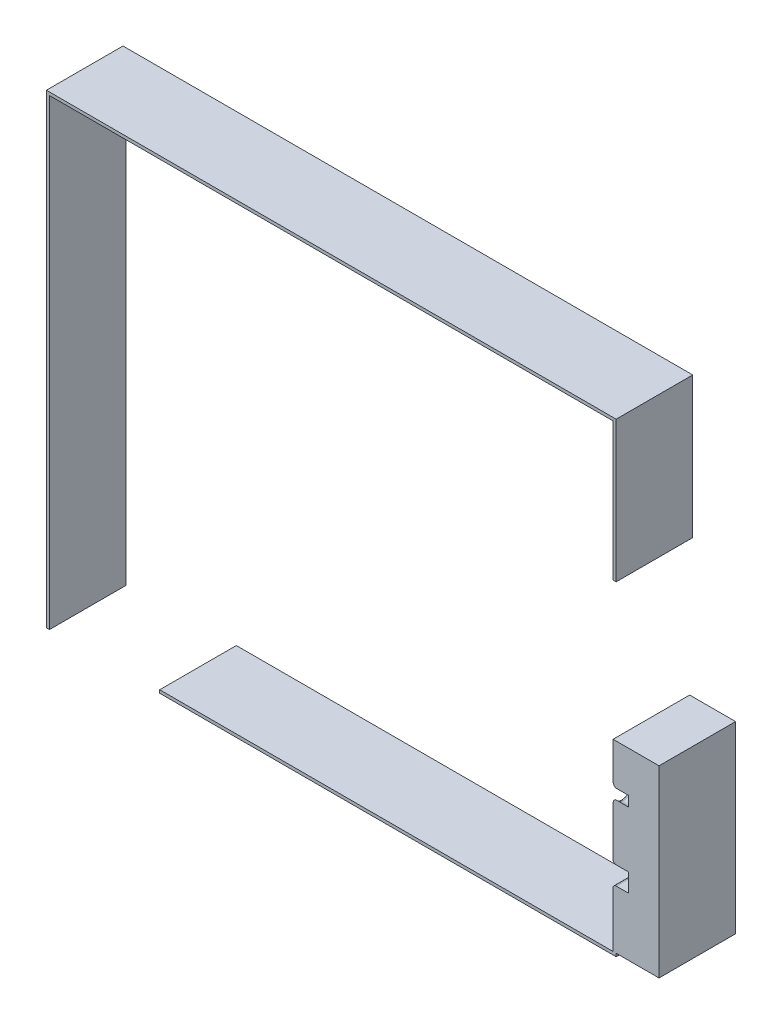
ISO-10303-21;
HEADER;
FILE_DESCRIPTION(('STEP AP214'),'2;1');
FILE_NAME('part.step','',(''),(''),'','','');
FILE_SCHEMA(('AUTOMOTIVE_DESIGN { 1 0 10303 214 1 1 1 1 }'));
ENDSEC;
DATA;
#1=APPLICATION_CONTEXT('core data for automotive mechanical design processes');
#2=APPLICATION_PROTOCOL_DEFINITION('international standard','automotive_design',2000,#1);
#3=PRODUCT_CONTEXT('',#1,'mechanical');
#4=PRODUCT('Part','Part','',(#3));
#5=PRODUCT_RELATED_PRODUCT_CATEGORY('part','',(#4));
#6=PRODUCT_DEFINITION_FORMATION('','',#4);
#7=PRODUCT_DEFINITION_CONTEXT('part definition',#1,'design');
#8=PRODUCT_DEFINITION('design','',#6,#7);
#9=PRODUCT_DEFINITION_SHAPE('','',#8);
#10=(LENGTH_UNIT() NAMED_UNIT(*) SI_UNIT(.MILLI.,.METRE.));
#11=(NAMED_UNIT(*) PLANE_ANGLE_UNIT() SI_UNIT($,.RADIAN.));
#12=(NAMED_UNIT(*) SI_UNIT($,.STERADIAN.) SOLID_ANGLE_UNIT());
#13=UNCERTAINTY_MEASURE_WITH_UNIT(LENGTH_MEASURE(1.E-05),#10,'distance_accuracy_value','');
#14=(GEOMETRIC_REPRESENTATION_CONTEXT(3) GLOBAL_UNCERTAINTY_ASSIGNED_CONTEXT((#13)) GLOBAL_UNIT_ASSIGNED_CONTEXT((#10,
#11,#12)) REPRESENTATION_CONTEXT('',''));
#15=CARTESIAN_POINT('',(0.,0.,0.));
#16=DIRECTION('',(0.,0.,1.));
#17=DIRECTION('',(1.,0.,0.));
#18=AXIS2_PLACEMENT_3D('',#15,#16,#17);
#19=CARTESIAN_POINT('',(774.501992031873,700.956175298805,260.));
#20=DIRECTION('',(-1.,0.,0.));
#21=DIRECTION('',(0.,0.,1.));
#22=AXIS2_PLACEMENT_3D('',#19,#20,#21);
#23=PLANE('',#22);
#24=DIRECTION('',(0.,1.,0.));
#25=VECTOR('',#24,1.);
#26=CARTESIAN_POINT('',(774.501992031873,700.956175298805,250.));
#27=LINE('',#26,#25);
#28=CARTESIAN_POINT('',(774.501992031873,-819.043824701195,250.));
#29=VERTEX_POINT('',#28);
#30=CARTESIAN_POINT('',(774.501992031873,-809.043824701195,250.));
#31=VERTEX_POINT('',#30);
#32=EDGE_CURVE('E84',#29,#31,#27,.T.);
#33=ORIENTED_EDGE('',*,*,#32,.F.);
#34=DIRECTION('',(0.,0.,-1.));
#35=VECTOR('',#34,1.);
#36=CARTESIAN_POINT('',(774.501992031873,-819.043824701195,260.));
#37=LINE('',#36,#35);
#38=CARTESIAN_POINT('',(774.501992031873,-819.043824701195,0.));
#39=VERTEX_POINT('',#38);
#40=EDGE_CURVE('E300',#29,#39,#37,.T.);
#41=ORIENTED_EDGE('',*,*,#40,.T.);
#42=DIRECTION('',(0.,1.,0.));
#43=VECTOR('',#42,1.);
#44=CARTESIAN_POINT('',(774.501992031873,700.956175298805,0.));
#45=LINE('',#44,#43);
#46=CARTESIAN_POINT('',(774.501992031873,-809.043824701195,0.));
#47=VERTEX_POINT('',#46);
#48=EDGE_CURVE('E312',#39,#47,#45,.T.);
#49=ORIENTED_EDGE('',*,*,#48,.T.);
#50=DIRECTION('',(0.,0.,-1.));
#51=VECTOR('',#50,1.);
#52=CARTESIAN_POINT('',(774.501992031873,-809.043824701195,250.));
#53=LINE('',#52,#51);
#54=EDGE_CURVE('E303',#31,#47,#53,.T.);
#55=ORIENTED_EDGE('',*,*,#54,.F.);
#56=EDGE_LOOP('',(#33,#41,#49,#55));
#57=FACE_BOUND('',#56,.T.);
#58=ADVANCED_FACE('F50',(#57),#23,.F.);
#59=CARTESIAN_POINT('',(-1085.49800796813,-819.043824701195,260.));
#60=DIRECTION('',(0.,1.,0.));
#61=DIRECTION('',(0.,0.,1.));
#62=AXIS2_PLACEMENT_3D('',#59,#60,#61);
#63=PLANE('',#62);
#64=DIRECTION('',(1.,0.,0.));
#65=VECTOR('',#64,1.);
#66=CARTESIAN_POINT('',(-1085.49800796813,-819.043824701195,250.));
#67=LINE('',#66,#65);
#68=CARTESIAN_POINT('',(-715.498007968127,-819.043824701195,250.));
#69=VERTEX_POINT('',#68);
#70=EDGE_CURVE('E54',#69,#29,#67,.T.);
#71=ORIENTED_EDGE('',*,*,#70,.F.);
#72=DIRECTION('',(0.,0.,1.));
#73=VECTOR('',#72,1.);
#74=CARTESIAN_POINT('',(-715.498007968127,-819.043824701195,250.));
#75=LINE('',#74,#73);
#76=CARTESIAN_POINT('',(-715.498007968127,-819.043824701195,0.));
#77=VERTEX_POINT('',#76);
#78=EDGE_CURVE('E217',#77,#69,#75,.T.);
#79=ORIENTED_EDGE('',*,*,#78,.F.);
#80=DIRECTION('',(1.,0.,0.));
#81=VECTOR('',#80,1.);
#82=CARTESIAN_POINT('',(-1085.49800796813,-819.043824701195,0.));
#83=LINE('',#82,#81);
#84=EDGE_CURVE('E309',#77,#39,#83,.T.);
#85=ORIENTED_EDGE('',*,*,#84,.T.);
#86=ORIENTED_EDGE('',*,*,#40,.F.);
#87=EDGE_LOOP('',(#71,#79,#85,#86));
#88=FACE_BOUND('',#87,.T.);
#89=ADVANCED_FACE('F291',(#88),#63,.F.);
#90=CARTESIAN_POINT('',(0.,0.,0.));
#91=DIRECTION('',(0.,0.,1.));
#92=DIRECTION('',(1.,0.,0.));
#93=AXIS2_PLACEMENT_3D('',#90,#91,#92);
#94=PLANE('',#93);
#95=DIRECTION('',(0.,-1.,0.));
#96=VECTOR('',#95,1.);
#97=CARTESIAN_POINT('',(764.501992031873,690.956175298805,0.));
#98=LINE('',#97,#96);
#99=CARTESIAN_POINT('',(764.501992031873,-209.043824701195,0.));
#100=VERTEX_POINT('',#99);
#101=CARTESIAN_POINT('',(764.501992031873,-809.043824701195,0.));
#102=VERTEX_POINT('',#101);
#103=EDGE_CURVE('E402',#100,#102,#98,.T.);
#104=ORIENTED_EDGE('',*,*,#103,.F.);
#105=DIRECTION('',(-1.,0.,0.));
#106=VECTOR('',#105,1.);
#107=CARTESIAN_POINT('',(914.501992031873,-209.043824701195,0.));
#108=LINE('',#107,#106);
#109=CARTESIAN_POINT('',(914.501992031873,-209.043824701195,0.));
#110=VERTEX_POINT('',#109);
#111=EDGE_CURVE('E337',#110,#100,#108,.T.);
#112=ORIENTED_EDGE('',*,*,#111,.F.);
#113=DIRECTION('',(0.,1.,0.));
#114=VECTOR('',#113,1.);
#115=CARTESIAN_POINT('',(914.501992031873,-809.043824701195,0.));
#116=LINE('',#115,#114);
#117=CARTESIAN_POINT('',(914.501992031873,-809.043824701195,0.));
#118=VERTEX_POINT('',#117);
#119=EDGE_CURVE('E356',#118,#110,#116,.T.);
#120=ORIENTED_EDGE('',*,*,#119,.F.);
#121=DIRECTION('',(-1.,0.,0.));
#122=VECTOR('',#121,1.);
#123=CARTESIAN_POINT('',(914.501992031873,-809.043824701195,0.));
#124=LINE('',#123,#122);
#125=EDGE_CURVE('E338',#118,#47,#124,.T.);
#126=ORIENTED_EDGE('',*,*,#125,.T.);
#127=ORIENTED_EDGE('',*,*,#48,.F.);
#128=ORIENTED_EDGE('',*,*,#84,.F.);
#129=DIRECTION('',(0.,-1.,0.));
#130=VECTOR('',#129,1.);
#131=CARTESIAN_POINT('',(-715.498007968127,-809.043824701195,0.));
#132=LINE('',#131,#130);
#133=CARTESIAN_POINT('',(-715.498007968127,-809.043824701195,0.));
#134=VERTEX_POINT('',#133);
#135=EDGE_CURVE('E390',#134,#77,#132,.T.);
#136=ORIENTED_EDGE('',*,*,#135,.F.);
#137=DIRECTION('',(-1.,0.,0.));
#138=VECTOR('',#137,1.);
#139=CARTESIAN_POINT('',(764.501992031873,-809.043824701195,0.));
#140=LINE('',#139,#138);
#141=EDGE_CURVE('E325',#102,#134,#140,.T.);
#142=ORIENTED_EDGE('',*,*,#141,.F.);
#143=EDGE_LOOP('',(#104,#112,#120,#126,#127,#128,#136,#142));
#144=FACE_BOUND('',#143,.T.);
#145=ADVANCED_FACE('F288',(#144),#94,.F.);
#146=CARTESIAN_POINT('',(764.501992031873,690.956175298805,250.));
#147=DIRECTION('',(1.,0.,0.));
#148=DIRECTION('',(0.,1.,0.));
#149=AXIS2_PLACEMENT_3D('',#146,#147,#148);
#150=PLANE('',#149);
#151=DIRECTION('',(0.,-1.,0.));
#152=VECTOR('',#151,1.);
#153=CARTESIAN_POINT('',(764.501992031873,690.956175298805,250.));
#154=LINE('',#153,#152);
#155=CARTESIAN_POINT('',(764.501992031873,-209.043824701195,250.));
#156=VERTEX_POINT('',#155);
#157=CARTESIAN_POINT('',(764.501992031873,-327.818834709203,250.));
#158=VERTEX_POINT('',#157);
#159=EDGE_CURVE('E234',#156,#158,#154,.T.);
#160=ORIENTED_EDGE('',*,*,#159,.F.);
#161=DIRECTION('',(0.,0.,-1.));
#162=VECTOR('',#161,1.);
#163=CARTESIAN_POINT('',(764.501992031873,-209.043824701195,250.));
#164=LINE('',#163,#162);
#165=EDGE_CURVE('E342',#156,#100,#164,.T.);
#166=ORIENTED_EDGE('',*,*,#165,.T.);
#167=ORIENTED_EDGE('',*,*,#103,.T.);
#168=DIRECTION('',(0.,0.,-1.));
#169=VECTOR('',#168,1.);
#170=CARTESIAN_POINT('',(764.501992031873,-809.043824701195,250.));
#171=LINE('',#170,#169);
#172=CARTESIAN_POINT('',(764.501992031873,-809.043824701195,250.));
#173=VERTEX_POINT('',#172);
#174=EDGE_CURVE('E319',#173,#102,#171,.T.);
#175=ORIENTED_EDGE('',*,*,#174,.F.);
#176=CARTESIAN_POINT('',(764.501992031873,-629.043824701195,250.));
#177=VERTEX_POINT('',#176);
#178=EDGE_CURVE('E333',#177,#173,#154,.T.);
#179=ORIENTED_EDGE('',*,*,#178,.F.);
#180=DIRECTION('',(0.,0.,1.));
#181=VECTOR('',#180,1.);
#182=CARTESIAN_POINT('',(764.501992031873,-629.043824701195,250.000000000002));
#183=LINE('',#182,#181);
#184=CARTESIAN_POINT('',(764.501992031873,-629.043824701195,180.));
#185=VERTEX_POINT('',#184);
#186=EDGE_CURVE('E409',#177,#185,#183,.F.);
#187=ORIENTED_EDGE('',*,*,#186,.T.);
#188=DIRECTION('',(0.,-1.,0.));
#189=VECTOR('',#188,1.);
#190=CARTESIAN_POINT('',(764.501992031873,690.956175298805,180.));
#191=LINE('',#190,#189);
#192=CARTESIAN_POINT('',(764.501992031873,-549.043824701195,180.));
#193=VERTEX_POINT('',#192);
#194=EDGE_CURVE('E210',#185,#193,#191,.F.);
#195=ORIENTED_EDGE('',*,*,#194,.T.);
#196=DIRECTION('',(0.,0.,-1.));
#197=VECTOR('',#196,1.);
#198=CARTESIAN_POINT('',(764.501992031873,-549.043824701195,249.999999999998));
#199=LINE('',#198,#197);
#200=CARTESIAN_POINT('',(764.501992031873,-549.043824701195,250.));
#201=VERTEX_POINT('',#200);
#202=EDGE_CURVE('E417',#193,#201,#199,.F.);
#203=ORIENTED_EDGE('',*,*,#202,.T.);
#204=CARTESIAN_POINT('',(764.501992031873,-390.268814693187,250.));
#205=VERTEX_POINT('',#204);
#206=EDGE_CURVE('E61',#205,#201,#154,.T.);
#207=ORIENTED_EDGE('',*,*,#206,.F.);
#208=CARTESIAN_POINT('',(764.501992031873,-359.043824701195,225.));
#209=DIRECTION('',(1.,0.,0.));
#210=DIRECTION('',(0.,1.,0.));
#211=AXIS2_PLACEMENT_3D('',#208,#209,#210);
#212=CIRCLE('',#211,40.);
#213=EDGE_CURVE('E329',#205,#158,#212,.T.);
#214=ORIENTED_EDGE('',*,*,#213,.T.);
#215=EDGE_LOOP('',(#160,#166,#167,#175,#179,#187,#195,#203,#207,#214));
#216=FACE_BOUND('',#215,.T.);
#217=ADVANCED_FACE('F52',(#216),#150,.F.);
#218=CARTESIAN_POINT('',(764.501992031873,-809.043824701195,250.));
#219=DIRECTION('',(0.,-1.,0.));
#220=DIRECTION('',(0.,0.,-1.));
#221=AXIS2_PLACEMENT_3D('',#218,#219,#220);
#222=PLANE('',#221);
#223=ORIENTED_EDGE('',*,*,#141,.T.);
#224=DIRECTION('',(0.,0.,1.));
#225=VECTOR('',#224,1.);
#226=CARTESIAN_POINT('',(-715.498007968127,-809.043824701195,250.));
#227=LINE('',#226,#225);
#228=CARTESIAN_POINT('',(-715.498007968127,-809.043824701195,250.));
#229=VERTEX_POINT('',#228);
#230=EDGE_CURVE('E324',#134,#229,#227,.T.);
#231=ORIENTED_EDGE('',*,*,#230,.T.);
#232=DIRECTION('',(-1.,0.,0.));
#233=VECTOR('',#232,1.);
#234=CARTESIAN_POINT('',(764.501992031873,-809.043824701195,250.));
#235=LINE('',#234,#233);
#236=EDGE_CURVE('E330',#173,#229,#235,.T.);
#237=ORIENTED_EDGE('',*,*,#236,.F.);
#238=ORIENTED_EDGE('',*,*,#174,.T.);
#239=EDGE_LOOP('',(#223,#231,#237,#238));
#240=FACE_BOUND('',#239,.T.);
#241=ADVANCED_FACE('F246',(#240),#222,.F.);
#242=CARTESIAN_POINT('',(914.501992031873,-809.043824701195,250.));
#243=DIRECTION('',(0.,0.,-1.));
#244=DIRECTION('',(-1.,0.,0.));
#245=AXIS2_PLACEMENT_3D('',#242,#243,#244);
#246=PLANE('',#245);
#247=DIRECTION('',(-1.,0.,0.));
#248=VECTOR('',#247,1.);
#249=CARTESIAN_POINT('',(815.501992031873,-375.626948652972,250.));
#250=LINE('',#249,#248);
#251=CARTESIAN_POINT('',(815.501992031873,-375.626948652972,250.));
#252=VERTEX_POINT('',#251);
#253=CARTESIAN_POINT('',(774.501992031873,-375.626948652972,250.));
#254=VERTEX_POINT('',#253);
#255=EDGE_CURVE('E349',#252,#254,#250,.T.);
#256=ORIENTED_EDGE('',*,*,#255,.T.);
#257=CARTESIAN_POINT('',(774.501992031873,-375.626948652972,250.));
#258=CARTESIAN_POINT('',(774.332332747441,-375.626867004223,250.));
#259=CARTESIAN_POINT('',(774.162717411699,-375.634756488665,250.));
#260=CARTESIAN_POINT('',(773.825102004959,-375.665848802505,250.));
#261=CARTESIAN_POINT('',(773.657100184645,-375.689032538901,250.));
#262=CARTESIAN_POINT('',(773.325770413382,-375.74972813429,250.));
#263=CARTESIAN_POINT('',(773.162410728326,-375.787068213041,250.));
#264=CARTESIAN_POINT('',(772.839288810197,-375.875074126683,250.));
#265=CARTESIAN_POINT('',(772.679527919924,-375.925744849,250.));
#266=CARTESIAN_POINT('',(772.320325820506,-376.055104301527,250.));
#267=CARTESIAN_POINT('',(772.122276990802,-376.137665640061,250.));
#268=CARTESIAN_POINT('',(771.734229749593,-376.320107253631,250.));
#269=CARTESIAN_POINT('',(771.544237691264,-376.420000891272,250.));
#270=CARTESIAN_POINT('',(771.171946040351,-376.635105797585,250.));
#271=CARTESIAN_POINT('',(770.989688405212,-376.750389277588,250.));
#272=CARTESIAN_POINT('',(770.633975373029,-376.993636201645,250.));
#273=CARTESIAN_POINT('',(770.460517858973,-377.121596573986,250.));
#274=CARTESIAN_POINT('',(770.023732588341,-377.465962775526,250.));
#275=CARTESIAN_POINT('',(769.766815430753,-377.690521745069,250.));
#276=CARTESIAN_POINT('',(769.273320443903,-378.160984913774,250.));
#277=CARTESIAN_POINT('',(769.036754492343,-378.406901411972,250.));
#278=CARTESIAN_POINT('',(768.582584553028,-378.916244506959,250.));
#279=CARTESIAN_POINT('',(768.365009170776,-379.179696500201,250.));
#280=CARTESIAN_POINT('',(767.948324057004,-379.720692485235,250.));
#281=CARTESIAN_POINT('',(767.749212793234,-379.998235304733,250.));
#282=CARTESIAN_POINT('',(767.277676383338,-380.700845626638,250.));
#283=CARTESIAN_POINT('',(767.015736100584,-381.132980434541,250.));
#284=CARTESIAN_POINT('',(766.52938554951,-382.017986065456,250.));
#285=CARTESIAN_POINT('',(766.304992853341,-382.470866471759,250.));
#286=CARTESIAN_POINT('',(765.893927851105,-383.393013612997,250.));
#287=CARTESIAN_POINT('',(765.707227952478,-383.862268064205,250.));
#288=CARTESIAN_POINT('',(765.372153936983,-384.814139231278,250.));
#289=CARTESIAN_POINT('',(765.223768307795,-385.296751885024,250.));
#290=CARTESIAN_POINT('',(764.998846790571,-386.150385154389,250.));
#291=CARTESIAN_POINT('',(764.913622591975,-386.519139221415,250.));
#292=CARTESIAN_POINT('',(764.76630780918,-387.261180145312,250.));
#293=CARTESIAN_POINT('',(764.704211975644,-387.634465953749,250.));
#294=CARTESIAN_POINT('',(764.60413276586,-388.383657629953,250.));
#295=CARTESIAN_POINT('',(764.566110272547,-388.759558238651,250.));
#296=CARTESIAN_POINT('',(764.515040308967,-389.513219434317,250.));
#297=CARTESIAN_POINT('',(764.502004583039,-389.8909808123,250.));
#298=CARTESIAN_POINT('',(764.501992031873,-390.268814693187,250.));
#299=B_SPLINE_CURVE_WITH_KNOTS('',3,(#257,#258,#259,#260,#261,#262,#263,#264,#265,#266,#267,
#268,#269,#270,#271,#272,#273,#274,#275,#276,#277,#278,#279,#280,#281,#282,#283,#284,#285,#286,
#287,#288,#289,#290,#291,#292,#293,#294,#295,#296,#297,#298),.UNSPECIFIED.,.F.,.F.,(4,2,2,2,2,2,
2,2,2,2,2,2,2,2,2,2,2,2,2,2,4),(0.,0.508724341793825,1.0168148022866,1.51892754787206,
2.02122464071601,2.66393874597717,3.3071505814844,3.95349412486999,4.59968143527821,
5.62172387135582,6.64435881788831,7.66850849272956,8.69257310210538,10.2064480963405,
11.7210296097,13.2344983392577,14.7475117850878,15.8822570883588,17.0167446865562,
18.1493840785762,19.2825557059969),.UNSPECIFIED.);
#300=EDGE_CURVE('E233',#254,#205,#299,.T.);
#301=ORIENTED_EDGE('',*,*,#300,.T.);
#302=ORIENTED_EDGE('',*,*,#206,.T.);
#303=CARTESIAN_POINT('',(774.501992031873,-549.043824701195,250.));
#304=DIRECTION('',(0.,0.,-1.));
#305=DIRECTION('',(-1.,0.,0.));
#306=AXIS2_PLACEMENT_3D('',#303,#304,#305);
#307=CIRCLE('',#306,10.);
#308=CARTESIAN_POINT('',(774.501992031873,-559.043824701195,250.));
#309=VERTEX_POINT('',#308);
#310=EDGE_CURVE('E12',#201,#309,#307,.F.);
#311=ORIENTED_EDGE('',*,*,#310,.T.);
#312=DIRECTION('',(-1.,0.,0.));
#313=VECTOR('',#312,1.);
#314=CARTESIAN_POINT('',(815.501992031873,-559.043824701195,250.));
#315=LINE('',#314,#313);
#316=CARTESIAN_POINT('',(815.501992031873,-559.043824701195,250.));
#317=VERTEX_POINT('',#316);
#318=EDGE_CURVE('E185',#317,#309,#315,.T.);
#319=ORIENTED_EDGE('',*,*,#318,.F.);
#320=DIRECTION('',(0.,1.,0.));
#321=VECTOR('',#320,1.);
#322=CARTESIAN_POINT('',(815.501992031873,-619.043824701195,250.));
#323=LINE('',#322,#321);
#324=CARTESIAN_POINT('',(815.501992031873,-619.043824701195,250.));
#325=VERTEX_POINT('',#324);
#326=EDGE_CURVE('E220',#325,#317,#323,.T.);
#327=ORIENTED_EDGE('',*,*,#326,.F.);
#328=DIRECTION('',(-1.,0.,0.));
#329=VECTOR('',#328,1.);
#330=CARTESIAN_POINT('',(815.501992031873,-619.043824701195,250.));
#331=LINE('',#330,#329);
#332=CARTESIAN_POINT('',(774.501992031873,-619.043824701195,250.));
#333=VERTEX_POINT('',#332);
#334=EDGE_CURVE('E323',#325,#333,#331,.T.);
#335=ORIENTED_EDGE('',*,*,#334,.T.);
#336=CARTESIAN_POINT('',(774.501992031873,-629.043824701195,250.));
#337=DIRECTION('',(0.,0.,-1.));
#338=DIRECTION('',(-1.,0.,0.));
#339=AXIS2_PLACEMENT_3D('',#336,#337,#338);
#340=CIRCLE('',#339,10.);
#341=EDGE_CURVE('E205',#333,#177,#340,.F.);
#342=ORIENTED_EDGE('',*,*,#341,.T.);
#343=ORIENTED_EDGE('',*,*,#178,.T.);
#344=ORIENTED_EDGE('',*,*,#236,.T.);
#345=DIRECTION('',(0.,-1.,0.));
#346=VECTOR('',#345,1.);
#347=CARTESIAN_POINT('',(-715.498007968127,-809.043824701195,250.));
#348=LINE('',#347,#346);
#349=EDGE_CURVE('E92',#229,#69,#348,.T.);
#350=ORIENTED_EDGE('',*,*,#349,.T.);
#351=ORIENTED_EDGE('',*,*,#70,.T.);
#352=ORIENTED_EDGE('',*,*,#32,.T.);
#353=DIRECTION('',(-1.,0.,0.));
#354=VECTOR('',#353,1.);
#355=CARTESIAN_POINT('',(914.501992031873,-809.043824701195,250.));
#356=LINE('',#355,#354);
#357=CARTESIAN_POINT('',(914.501992031873,-809.043824701195,250.));
#358=VERTEX_POINT('',#357);
#359=EDGE_CURVE('E334',#358,#31,#356,.T.);
#360=ORIENTED_EDGE('',*,*,#359,.F.);
#361=DIRECTION('',(0.,-1.,0.));
#362=VECTOR('',#361,1.);
#363=CARTESIAN_POINT('',(914.501992031873,-809.043824701195,250.));
#364=LINE('',#363,#362);
#365=CARTESIAN_POINT('',(914.501992031873,-209.043824701195,250.));
#366=VERTEX_POINT('',#365);
#367=EDGE_CURVE('E345',#366,#358,#364,.T.);
#368=ORIENTED_EDGE('',*,*,#367,.F.);
#369=DIRECTION('',(-1.,0.,0.));
#370=VECTOR('',#369,1.);
#371=CARTESIAN_POINT('',(914.501992031873,-209.043824701195,250.));
#372=LINE('',#371,#370);
#373=EDGE_CURVE('E346',#366,#156,#372,.T.);
#374=ORIENTED_EDGE('',*,*,#373,.T.);
#375=ORIENTED_EDGE('',*,*,#159,.T.);
#376=CARTESIAN_POINT('',(764.501992031873,-327.818834709203,250.));
#377=CARTESIAN_POINT('',(764.502012454607,-328.240954334075,250.));
#378=CARTESIAN_POINT('',(764.518277964956,-328.662965229524,250.));
#379=CARTESIAN_POINT('',(764.581855677374,-329.50444354691,250.));
#380=CARTESIAN_POINT('',(764.62915223153,-329.923912143303,250.));
#381=CARTESIAN_POINT('',(764.753554828446,-330.759775988604,250.));
#382=CARTESIAN_POINT('',(764.830757989865,-331.176156673261,250.));
#383=CARTESIAN_POINT('',(765.013740334953,-332.002649752099,250.));
#384=CARTESIAN_POINT('',(765.119525106252,-332.412760904021,250.));
#385=CARTESIAN_POINT('',(765.379516719992,-333.295768204203,250.));
#386=CARTESIAN_POINT('',(765.538952035756,-333.76713238465,250.));
#387=CARTESIAN_POINT('',(765.894696849919,-334.695861544792,250.));
#388=CARTESIAN_POINT('',(766.091015376203,-335.15322306512,250.));
#389=CARTESIAN_POINT('',(766.51979251477,-336.050129296687,250.));
#390=CARTESIAN_POINT('',(766.752214063778,-336.489691703446,250.));
#391=CARTESIAN_POINT('',(767.253620587382,-337.347321840199,250.));
#392=CARTESIAN_POINT('',(767.522585420055,-337.765401237458,250.));
#393=CARTESIAN_POINT('',(767.978853069532,-338.406395654001,250.));
#394=CARTESIAN_POINT('',(768.153676634618,-338.638250259851,250.));
#395=CARTESIAN_POINT('',(768.516788336242,-339.091133844962,250.));
#396=CARTESIAN_POINT('',(768.705073421308,-339.312165258619,250.));
#397=CARTESIAN_POINT('',(769.095726544096,-339.741438116703,250.));
#398=CARTESIAN_POINT('',(769.298092372967,-339.949681557579,250.));
#399=CARTESIAN_POINT('',(769.717493623627,-340.350672361221,250.));
#400=CARTESIAN_POINT('',(769.934525240193,-340.543423715404,250.));
#401=CARTESIAN_POINT('',(770.490438982594,-340.996874805893,250.));
#402=CARTESIAN_POINT('',(770.838506397372,-341.246735879184,250.));
#403=CARTESIAN_POINT('',(771.385221866259,-341.578868424355,250.));
#404=CARTESIAN_POINT('',(771.571154197027,-341.682299780878,250.));
#405=CARTESIAN_POINT('',(771.951249275857,-341.87291092491,250.));
#406=CARTESIAN_POINT('',(772.145410887294,-341.960092947851,250.));
#407=CARTESIAN_POINT('',(772.513720451722,-342.104866163749,250.));
#408=CARTESIAN_POINT('',(772.686913119163,-342.164883776929,250.));
#409=CARTESIAN_POINT('',(773.037885910787,-342.269352930728,250.));
#410=CARTESIAN_POINT('',(773.215664089612,-342.313810959409,250.));
#411=CARTESIAN_POINT('',(773.577099801488,-342.386286792664,250.));
#412=CARTESIAN_POINT('',(773.760804291725,-342.414074780413,250.));
#413=CARTESIAN_POINT('',(774.037840577027,-342.441987192579,250.));
#414=CARTESIAN_POINT('',(774.130520456911,-342.448996494355,250.));
#415=CARTESIAN_POINT('',(774.316125462848,-342.458355761435,250.));
#416=CARTESIAN_POINT('',(774.409050615643,-342.460705195708,250.));
#417=CARTESIAN_POINT('',(774.501992031873,-342.460700749418,250.));
#418=B_SPLINE_CURVE_WITH_KNOTS('',3,(#376,#377,#378,#379,#380,#381,#382,#383,#384,#385,#386,
#387,#388,#389,#390,#391,#392,#393,#394,#395,#396,#397,#398,#399,#400,#401,#402,#403,#404,#405,
#406,#407,#408,#409,#410,#411,#412,#413,#414,#415,#416,#417),.UNSPECIFIED.,.F.,.F.,(4,2,2,2,2,2,
2,2,2,2,2,2,2,2,2,2,2,2,2,2,4),(0.,1.26588921076289,2.53114056625588,3.80053561428651,
5.07017900551143,6.56137457698765,8.05293562428517,9.54297543698063,11.0321972765121,
11.9029030288216,12.7734120305463,13.643784781774,14.5139325645683,15.7945486677881,
16.4322323606879,17.0698282621503,17.619065785894,18.168074014026,18.7244867362225,
19.0032178619471,19.2819807495929),.UNSPECIFIED.);
#419=CARTESIAN_POINT('',(774.501992031873,-342.460700749418,250.));
#420=VERTEX_POINT('',#419);
#421=EDGE_CURVE('E223',#158,#420,#418,.T.);
#422=ORIENTED_EDGE('',*,*,#421,.T.);
#423=DIRECTION('',(-1.,0.,0.));
#424=VECTOR('',#423,1.);
#425=CARTESIAN_POINT('',(815.501992031873,-342.460700749418,250.));
#426=LINE('',#425,#424);
#427=CARTESIAN_POINT('',(815.501992031873,-342.460700749418,250.));
#428=VERTEX_POINT('',#427);
#429=EDGE_CURVE('E355',#428,#420,#426,.T.);
#430=ORIENTED_EDGE('',*,*,#429,.F.);
#431=DIRECTION('',(0.,1.,0.));
#432=VECTOR('',#431,1.);
#433=CARTESIAN_POINT('',(815.501992031873,-1.51048348646727E-13,250.));
#434=LINE('',#433,#432);
#435=EDGE_CURVE('E375',#252,#428,#434,.T.);
#436=ORIENTED_EDGE('',*,*,#435,.F.);
#437=EDGE_LOOP('',(#256,#301,#302,#311,#319,#327,#335,#342,#343,#344,#350,#351,#352,#360,#368,
#374,#375,#422,#430,#436));
#438=FACE_BOUND('',#437,.T.);
#439=ADVANCED_FACE('F248',(#438),#246,.F.);
#440=CARTESIAN_POINT('',(914.501992031873,-809.043824701195,250.));
#441=DIRECTION('',(0.,1.,0.));
#442=DIRECTION('',(0.,0.,1.));
#443=AXIS2_PLACEMENT_3D('',#440,#441,#442);
#444=PLANE('',#443);
#445=ORIENTED_EDGE('',*,*,#54,.T.);
#446=ORIENTED_EDGE('',*,*,#125,.F.);
#447=DIRECTION('',(0.,0.,-1.));
#448=VECTOR('',#447,1.);
#449=CARTESIAN_POINT('',(914.501992031873,-809.043824701195,250.));
#450=LINE('',#449,#448);
#451=EDGE_CURVE('E359',#358,#118,#450,.T.);
#452=ORIENTED_EDGE('',*,*,#451,.F.);
#453=ORIENTED_EDGE('',*,*,#359,.T.);
#454=EDGE_LOOP('',(#445,#446,#452,#453));
#455=FACE_BOUND('',#454,.T.);
#456=ADVANCED_FACE('F252',(#455),#444,.F.);
#457=CARTESIAN_POINT('',(914.501992031873,-209.043824701195,250.));
#458=DIRECTION('',(0.,-1.,0.));
#459=DIRECTION('',(0.,0.,-1.));
#460=AXIS2_PLACEMENT_3D('',#457,#458,#459);
#461=PLANE('',#460);
#462=ORIENTED_EDGE('',*,*,#111,.T.);
#463=ORIENTED_EDGE('',*,*,#165,.F.);
#464=ORIENTED_EDGE('',*,*,#373,.F.);
#465=DIRECTION('',(0.,0.,1.));
#466=VECTOR('',#465,1.);
#467=CARTESIAN_POINT('',(914.501992031873,-209.043824701195,250.));
#468=LINE('',#467,#466);
#469=EDGE_CURVE('E352',#110,#366,#468,.T.);
#470=ORIENTED_EDGE('',*,*,#469,.F.);
#471=EDGE_LOOP('',(#462,#463,#464,#470));
#472=FACE_BOUND('',#471,.T.);
#473=ADVANCED_FACE('F255',(#472),#461,.F.);
#474=CARTESIAN_POINT('',(914.501992031873,0.,0.));
#475=DIRECTION('',(-1.,0.,0.));
#476=DIRECTION('',(0.,0.,1.));
#477=AXIS2_PLACEMENT_3D('',#474,#475,#476);
#478=PLANE('',#477);
#479=ORIENTED_EDGE('',*,*,#367,.T.);
#480=ORIENTED_EDGE('',*,*,#451,.T.);
#481=ORIENTED_EDGE('',*,*,#119,.T.);
#482=ORIENTED_EDGE('',*,*,#469,.T.);
#483=EDGE_LOOP('',(#479,#480,#481,#482));
#484=FACE_BOUND('',#483,.T.);
#485=ADVANCED_FACE('F259',(#484),#478,.F.);
#486=CARTESIAN_POINT('',(815.501992031873,-359.043824701195,225.));
#487=DIRECTION('',(-1.,0.,0.));
#488=DIRECTION('',(0.,-1.,0.));
#489=AXIS2_PLACEMENT_3D('',#486,#487,#488);
#490=CYLINDRICAL_SURFACE('',#489,30.);
#491=ORIENTED_EDGE('',*,*,#429,.T.);
#492=CARTESIAN_POINT('',(774.501992031873,-359.043824701195,225.));
#493=DIRECTION('',(1.,0.,0.));
#494=DIRECTION('',(0.,1.,0.));
#495=AXIS2_PLACEMENT_3D('',#492,#493,#494);
#496=CIRCLE('',#495,30.);
#497=EDGE_CURVE('E368',#420,#254,#496,.F.);
#498=ORIENTED_EDGE('',*,*,#497,.T.);
#499=ORIENTED_EDGE('',*,*,#255,.F.);
#500=CARTESIAN_POINT('',(815.501992031873,-359.043824701195,225.));
#501=DIRECTION('',(-1.,0.,0.));
#502=DIRECTION('',(0.,-1.,0.));
#503=AXIS2_PLACEMENT_3D('',#500,#501,#502);
#504=CIRCLE('',#503,30.);
#505=EDGE_CURVE('E372',#428,#252,#504,.T.);
#506=ORIENTED_EDGE('',*,*,#505,.F.);
#507=EDGE_LOOP('',(#491,#498,#499,#506));
#508=FACE_BOUND('',#507,.T.);
#509=ADVANCED_FACE('F263',(#508),#490,.F.);
#510=CARTESIAN_POINT('',(815.501992031873,-1.51048348646727E-13,0.));
#511=DIRECTION('',(-1.,0.,0.));
#512=DIRECTION('',(0.,-1.,0.));
#513=AXIS2_PLACEMENT_3D('',#510,#511,#512);
#514=PLANE('',#513);
#515=ORIENTED_EDGE('',*,*,#435,.T.);
#516=ORIENTED_EDGE('',*,*,#505,.T.);
#517=EDGE_LOOP('',(#515,#516));
#518=FACE_BOUND('',#517,.T.);
#519=ADVANCED_FACE('F267',(#518),#514,.T.);
#520=CARTESIAN_POINT('',(815.501992031873,-619.043824701195,190.));
#521=DIRECTION('',(0.,0.,-1.));
#522=DIRECTION('',(-1.,0.,0.));
#523=AXIS2_PLACEMENT_3D('',#520,#521,#522);
#524=PLANE('',#523);
#525=DIRECTION('',(-1.,0.,0.));
#526=VECTOR('',#525,1.);
#527=CARTESIAN_POINT('',(815.501992031873,-559.043824701195,190.));
#528=LINE('',#527,#526);
#529=CARTESIAN_POINT('',(815.501992031873,-559.043824701195,190.));
#530=VERTEX_POINT('',#529);
#531=CARTESIAN_POINT('',(774.501992031873,-559.043824701195,190.));
#532=VERTEX_POINT('',#531);
#533=EDGE_CURVE('E179',#530,#532,#528,.T.);
#534=ORIENTED_EDGE('',*,*,#533,.T.);
#535=DIRECTION('',(0.,-1.,0.));
#536=VECTOR('',#535,1.);
#537=CARTESIAN_POINT('',(774.501992031873,-619.043824701195,190.));
#538=LINE('',#537,#536);
#539=CARTESIAN_POINT('',(774.501992031873,-619.043824701195,190.));
#540=VERTEX_POINT('',#539);
#541=EDGE_CURVE('E173',#532,#540,#538,.T.);
#542=ORIENTED_EDGE('',*,*,#541,.T.);
#543=DIRECTION('',(-1.,0.,0.));
#544=VECTOR('',#543,1.);
#545=CARTESIAN_POINT('',(815.501992031873,-619.043824701195,190.));
#546=LINE('',#545,#544);
#547=CARTESIAN_POINT('',(815.501992031873,-619.043824701195,190.));
#548=VERTEX_POINT('',#547);
#549=EDGE_CURVE('E177',#548,#540,#546,.T.);
#550=ORIENTED_EDGE('',*,*,#549,.F.);
#551=DIRECTION('',(0.,-1.,0.));
#552=VECTOR('',#551,1.);
#553=CARTESIAN_POINT('',(815.501992031873,-619.043824701195,190.));
#554=LINE('',#553,#552);
#555=EDGE_CURVE('E207',#530,#548,#554,.T.);
#556=ORIENTED_EDGE('',*,*,#555,.F.);
#557=EDGE_LOOP('',(#534,#542,#550,#556));
#558=FACE_BOUND('',#557,.T.);
#559=ADVANCED_FACE('F175',(#558),#524,.F.);
#560=CARTESIAN_POINT('',(815.501992031873,-559.043824701195,190.));
#561=DIRECTION('',(0.,1.,0.));
#562=DIRECTION('',(0.,0.,1.));
#563=AXIS2_PLACEMENT_3D('',#560,#561,#562);
#564=PLANE('',#563);
#565=ORIENTED_EDGE('',*,*,#318,.T.);
#566=DIRECTION('',(0.,0.,-1.));
#567=VECTOR('',#566,1.);
#568=CARTESIAN_POINT('',(774.501992031873,-559.043824701195,190.));
#569=LINE('',#568,#567);
#570=EDGE_CURVE('E196',#309,#532,#569,.T.);
#571=ORIENTED_EDGE('',*,*,#570,.T.);
#572=ORIENTED_EDGE('',*,*,#533,.F.);
#573=DIRECTION('',(0.,0.,-1.));
#574=VECTOR('',#573,1.);
#575=CARTESIAN_POINT('',(815.501992031873,-559.043824701195,190.));
#576=LINE('',#575,#574);
#577=EDGE_CURVE('E213',#317,#530,#576,.T.);
#578=ORIENTED_EDGE('',*,*,#577,.F.);
#579=EDGE_LOOP('',(#565,#571,#572,#578));
#580=FACE_BOUND('',#579,.T.);
#581=ADVANCED_FACE('F274',(#580),#564,.F.);
#582=CARTESIAN_POINT('',(815.501992031873,-619.043824701195,190.));
#583=DIRECTION('',(0.,-1.,0.));
#584=DIRECTION('',(0.,0.,-1.));
#585=AXIS2_PLACEMENT_3D('',#582,#583,#584);
#586=PLANE('',#585);
#587=ORIENTED_EDGE('',*,*,#549,.T.);
#588=DIRECTION('',(0.,0.,1.));
#589=VECTOR('',#588,1.);
#590=CARTESIAN_POINT('',(774.501992031873,-619.043824701195,190.));
#591=LINE('',#590,#589);
#592=EDGE_CURVE('E191',#540,#333,#591,.T.);
#593=ORIENTED_EDGE('',*,*,#592,.T.);
#594=ORIENTED_EDGE('',*,*,#334,.F.);
#595=DIRECTION('',(0.,0.,1.));
#596=VECTOR('',#595,1.);
#597=CARTESIAN_POINT('',(815.501992031873,-619.043824701195,190.));
#598=LINE('',#597,#596);
#599=EDGE_CURVE('E193',#548,#325,#598,.T.);
#600=ORIENTED_EDGE('',*,*,#599,.F.);
#601=EDGE_LOOP('',(#587,#593,#594,#600));
#602=FACE_BOUND('',#601,.T.);
#603=ADVANCED_FACE('F189',(#602),#586,.F.);
#604=CARTESIAN_POINT('',(815.501992031873,0.,0.));
#605=DIRECTION('',(1.,0.,0.));
#606=DIRECTION('',(0.,0.,-1.));
#607=AXIS2_PLACEMENT_3D('',#604,#605,#606);
#608=PLANE('',#607);
#609=ORIENTED_EDGE('',*,*,#555,.T.);
#610=ORIENTED_EDGE('',*,*,#599,.T.);
#611=ORIENTED_EDGE('',*,*,#326,.T.);
#612=ORIENTED_EDGE('',*,*,#577,.T.);
#613=EDGE_LOOP('',(#609,#610,#611,#612));
#614=FACE_BOUND('',#613,.T.);
#615=ADVANCED_FACE('F277',(#614),#608,.F.);
#616=CARTESIAN_POINT('',(774.501992031873,-629.043824701195,190.));
#617=DIRECTION('',(0.,0.,1.));
#618=DIRECTION('',(0.,-1.,0.));
#619=AXIS2_PLACEMENT_3D('',#616,#617,#618);
#620=CYLINDRICAL_SURFACE('',#619,10.);
#621=ORIENTED_EDGE('',*,*,#341,.F.);
#622=ORIENTED_EDGE('',*,*,#592,.F.);
#623=CARTESIAN_POINT('',(774.501992031873,-629.043824701195,180.));
#624=DIRECTION('',(0.,-0.707106781186547,0.707106781186548));
#625=DIRECTION('',(0.,-0.707106781186548,-0.707106781186547));
#626=AXIS2_PLACEMENT_3D('',#623,#624,#625);
#627=ELLIPSE('',#626,14.142135623731,10.);
#628=EDGE_CURVE('E203',#185,#540,#627,.F.);
#629=ORIENTED_EDGE('',*,*,#628,.F.);
#630=ORIENTED_EDGE('',*,*,#186,.F.);
#631=EDGE_LOOP('',(#621,#622,#629,#630));
#632=FACE_BOUND('',#631,.T.);
#633=ADVANCED_FACE('F201',(#632),#620,.T.);
#634=CARTESIAN_POINT('',(774.501992031873,-619.043824701195,180.));
#635=DIRECTION('',(0.,-1.,0.));
#636=DIRECTION('',(1.,0.,0.));
#637=AXIS2_PLACEMENT_3D('',#634,#635,#636);
#638=CYLINDRICAL_SURFACE('',#637,10.);
#639=ORIENTED_EDGE('',*,*,#628,.T.);
#640=ORIENTED_EDGE('',*,*,#541,.F.);
#641=CARTESIAN_POINT('',(774.501992031873,-549.043824701195,180.));
#642=DIRECTION('',(0.,-0.707106781186547,-0.707106781186548));
#643=DIRECTION('',(0.,0.707106781186548,-0.707106781186547));
#644=AXIS2_PLACEMENT_3D('',#641,#642,#643);
#645=ELLIPSE('',#644,14.142135623731,10.);
#646=EDGE_CURVE('E212',#193,#532,#645,.F.);
#647=ORIENTED_EDGE('',*,*,#646,.F.);
#648=ORIENTED_EDGE('',*,*,#194,.F.);
#649=EDGE_LOOP('',(#639,#640,#647,#648));
#650=FACE_BOUND('',#649,.T.);
#651=ADVANCED_FACE('F209',(#650),#638,.T.);
#652=CARTESIAN_POINT('',(774.501992031873,-549.043824701195,190.));
#653=DIRECTION('',(0.,0.,-1.));
#654=DIRECTION('',(0.,1.,0.));
#655=AXIS2_PLACEMENT_3D('',#652,#653,#654);
#656=CYLINDRICAL_SURFACE('',#655,10.);
#657=ORIENTED_EDGE('',*,*,#310,.F.);
#658=ORIENTED_EDGE('',*,*,#202,.F.);
#659=ORIENTED_EDGE('',*,*,#646,.T.);
#660=ORIENTED_EDGE('',*,*,#570,.F.);
#661=EDGE_LOOP('',(#657,#658,#659,#660));
#662=FACE_BOUND('',#661,.T.);
#663=ADVANCED_FACE('F563',(#662),#656,.T.);
#664=CARTESIAN_POINT('',(774.501992031873,-359.043824701195,225.));
#665=DIRECTION('',(1.,0.,0.));
#666=DIRECTION('',(0.,1.,0.));
#667=AXIS2_PLACEMENT_3D('',#664,#665,#666);
#668=TOROIDAL_SURFACE('',#667,40.,10.);
#669=ORIENTED_EDGE('',*,*,#421,.F.);
#670=ORIENTED_EDGE('',*,*,#213,.F.);
#671=ORIENTED_EDGE('',*,*,#300,.F.);
#672=ORIENTED_EDGE('',*,*,#497,.F.);
#673=EDGE_LOOP('',(#669,#670,#671,#672));
#674=FACE_BOUND('',#673,.T.);
#675=ADVANCED_FACE('F240',(#674),#668,.T.);
#676=CARTESIAN_POINT('',(-715.498007968127,-809.043824701195,250.));
#677=DIRECTION('',(1.,0.,0.));
#678=DIRECTION('',(0.,0.,-1.));
#679=AXIS2_PLACEMENT_3D('',#676,#677,#678);
#680=PLANE('',#679);
#681=ORIENTED_EDGE('',*,*,#78,.T.);
#682=ORIENTED_EDGE('',*,*,#349,.F.);
#683=ORIENTED_EDGE('',*,*,#230,.F.);
#684=ORIENTED_EDGE('',*,*,#135,.T.);
#685=EDGE_LOOP('',(#681,#682,#683,#684));
#686=FACE_BOUND('',#685,.T.);
#687=ADVANCED_FACE('F284',(#686),#680,.F.);
#688=CLOSED_SHELL('',(#58,#89,#145,#217,#241,#439,#456,#473,#485,#509,#519,#559,#581,#603,#615,
#633,#651,#663,#675,#687));
#689=MANIFOLD_SOLID_BREP('B2',#688);
#690=CARTESIAN_POINT('',(0.,0.,0.));
#691=DIRECTION('',(0.,0.,1.));
#692=DIRECTION('',(1.,0.,0.));
#693=AXIS2_PLACEMENT_3D('',#690,#691,#692);
#694=PLANE('',#693);
#695=DIRECTION('',(0.,1.,0.));
#696=VECTOR('',#695,1.);
#697=CARTESIAN_POINT('',(774.501992031873,700.956175298805,0.));
#698=LINE('',#697,#696);
#699=CARTESIAN_POINT('',(774.501992031873,240.956175298805,0.));
#700=VERTEX_POINT('',#699);
#701=CARTESIAN_POINT('',(774.501992031873,700.956175298805,0.));
#702=VERTEX_POINT('',#701);
#703=EDGE_CURVE('E685',#700,#702,#698,.T.);
#704=ORIENTED_EDGE('',*,*,#703,.F.);
#705=DIRECTION('',(1.,0.,0.));
#706=VECTOR('',#705,1.);
#707=CARTESIAN_POINT('',(764.501992031873,240.956175298805,0.));
#708=LINE('',#707,#706);
#709=CARTESIAN_POINT('',(764.501992031873,240.956175298805,0.));
#710=VERTEX_POINT('',#709);
#711=EDGE_CURVE('E698',#710,#700,#708,.T.);
#712=ORIENTED_EDGE('',*,*,#711,.F.);
#713=DIRECTION('',(0.,-1.,0.));
#714=VECTOR('',#713,1.);
#715=CARTESIAN_POINT('',(764.501992031873,690.956175298805,0.));
#716=LINE('',#715,#714);
#717=CARTESIAN_POINT('',(764.501992031873,690.956175298805,0.));
#718=VERTEX_POINT('',#717);
#719=EDGE_CURVE('E718',#718,#710,#716,.T.);
#720=ORIENTED_EDGE('',*,*,#719,.F.);
#721=DIRECTION('',(1.,0.,0.));
#722=VECTOR('',#721,1.);
#723=CARTESIAN_POINT('',(764.501992031873,690.956175298805,0.));
#724=LINE('',#723,#722);
#725=CARTESIAN_POINT('',(-1075.49800796813,690.956175298805,0.));
#726=VERTEX_POINT('',#725);
#727=EDGE_CURVE('E722',#726,#718,#724,.T.);
#728=ORIENTED_EDGE('',*,*,#727,.F.);
#729=DIRECTION('',(0.,1.,0.));
#730=VECTOR('',#729,1.);
#731=CARTESIAN_POINT('',(-1075.49800796813,690.956175298805,0.));
#732=LINE('',#731,#730);
#733=CARTESIAN_POINT('',(-1075.49800796813,-819.043824701195,0.));
#734=VERTEX_POINT('',#733);
#735=EDGE_CURVE('E727',#734,#726,#732,.T.);
#736=ORIENTED_EDGE('',*,*,#735,.F.);
#737=DIRECTION('',(1.,0.,0.));
#738=VECTOR('',#737,1.);
#739=CARTESIAN_POINT('',(-1085.49800796813,-819.043824701195,0.));
#740=LINE('',#739,#738);
#741=CARTESIAN_POINT('',(-1085.49800796813,-819.043824701195,0.));
#742=VERTEX_POINT('',#741);
#743=EDGE_CURVE('E682',#742,#734,#740,.T.);
#744=ORIENTED_EDGE('',*,*,#743,.F.);
#745=DIRECTION('',(0.,-1.,0.));
#746=VECTOR('',#745,1.);
#747=CARTESIAN_POINT('',(-1085.49800796813,700.956175298805,0.));
#748=LINE('',#747,#746);
#749=CARTESIAN_POINT('',(-1085.49800796813,700.956175298805,0.));
#750=VERTEX_POINT('',#749);
#751=EDGE_CURVE('E679',#750,#742,#748,.T.);
#752=ORIENTED_EDGE('',*,*,#751,.F.);
#753=DIRECTION('',(-1.,0.,0.));
#754=VECTOR('',#753,1.);
#755=CARTESIAN_POINT('',(-1085.49800796813,700.956175298805,0.));
#756=LINE('',#755,#754);
#757=EDGE_CURVE('E692',#702,#750,#756,.T.);
#758=ORIENTED_EDGE('',*,*,#757,.F.);
#759=EDGE_LOOP('',(#704,#712,#720,#728,#736,#744,#752,#758));
#760=FACE_BOUND('',#759,.T.);
#761=ADVANCED_FACE('F597',(#760),#694,.F.);
#762=CARTESIAN_POINT('',(-1075.49800796813,690.956175298805,250.));
#763=DIRECTION('',(-1.,0.,0.));
#764=DIRECTION('',(0.,0.,1.));
#765=AXIS2_PLACEMENT_3D('',#762,#763,#764);
#766=PLANE('',#765);
#767=ORIENTED_EDGE('',*,*,#735,.T.);
#768=DIRECTION('',(0.,0.,-1.));
#769=VECTOR('',#768,1.);
#770=CARTESIAN_POINT('',(-1075.49800796813,690.956175298805,250.));
#771=LINE('',#770,#769);
#772=CARTESIAN_POINT('',(-1075.49800796813,690.956175298805,250.));
#773=VERTEX_POINT('',#772);
#774=EDGE_CURVE('E687',#773,#726,#771,.T.);
#775=ORIENTED_EDGE('',*,*,#774,.F.);
#776=DIRECTION('',(0.,1.,0.));
#777=VECTOR('',#776,1.);
#778=CARTESIAN_POINT('',(-1075.49800796813,690.956175298805,250.));
#779=LINE('',#778,#777);
#780=CARTESIAN_POINT('',(-1075.49800796813,-819.043824701195,250.));
#781=VERTEX_POINT('',#780);
#782=EDGE_CURVE('E721',#781,#773,#779,.T.);
#783=ORIENTED_EDGE('',*,*,#782,.F.);
#784=DIRECTION('',(0.,0.,-1.));
#785=VECTOR('',#784,1.);
#786=CARTESIAN_POINT('',(-1075.49800796813,-819.043824701195,250.));
#787=LINE('',#786,#785);
#788=EDGE_CURVE('E675',#781,#734,#787,.T.);
#789=ORIENTED_EDGE('',*,*,#788,.T.);
#790=EDGE_LOOP('',(#767,#775,#783,#789));
#791=FACE_BOUND('',#790,.T.);
#792=ADVANCED_FACE('F751',(#791),#766,.F.);
#793=CARTESIAN_POINT('',(764.501992031873,690.956175298805,250.));
#794=DIRECTION('',(0.,1.,0.));
#795=DIRECTION('',(0.,0.,1.));
#796=AXIS2_PLACEMENT_3D('',#793,#794,#795);
#797=PLANE('',#796);
#798=ORIENTED_EDGE('',*,*,#727,.T.);
#799=DIRECTION('',(0.,0.,-1.));
#800=VECTOR('',#799,1.);
#801=CARTESIAN_POINT('',(764.501992031873,690.956175298805,250.));
#802=LINE('',#801,#800);
#803=CARTESIAN_POINT('',(764.501992031873,690.956175298805,250.));
#804=VERTEX_POINT('',#803);
#805=EDGE_CURVE('E683',#804,#718,#802,.T.);
#806=ORIENTED_EDGE('',*,*,#805,.F.);
#807=DIRECTION('',(1.,0.,0.));
#808=VECTOR('',#807,1.);
#809=CARTESIAN_POINT('',(764.501992031873,690.956175298805,250.));
#810=LINE('',#809,#808);
#811=EDGE_CURVE('E724',#773,#804,#810,.T.);
#812=ORIENTED_EDGE('',*,*,#811,.F.);
#813=ORIENTED_EDGE('',*,*,#774,.T.);
#814=EDGE_LOOP('',(#798,#806,#812,#813));
#815=FACE_BOUND('',#814,.T.);
#816=ADVANCED_FACE('F734',(#815),#797,.F.);
#817=CARTESIAN_POINT('',(-1085.49800796813,-819.043824701195,260.));
#818=DIRECTION('',(0.,1.,0.));
#819=DIRECTION('',(0.,0.,1.));
#820=AXIS2_PLACEMENT_3D('',#817,#818,#819);
#821=PLANE('',#820);
#822=DIRECTION('',(1.,0.,0.));
#823=VECTOR('',#822,1.);
#824=CARTESIAN_POINT('',(-1085.49800796813,-819.043824701195,250.));
#825=LINE('',#824,#823);
#826=CARTESIAN_POINT('',(-1085.49800796813,-819.043824701195,250.));
#827=VERTEX_POINT('',#826);
#828=EDGE_CURVE('E664',#827,#781,#825,.T.);
#829=ORIENTED_EDGE('',*,*,#828,.F.);
#830=DIRECTION('',(0.,0.,-1.));
#831=VECTOR('',#830,1.);
#832=CARTESIAN_POINT('',(-1085.49800796813,-819.043824701195,260.));
#833=LINE('',#832,#831);
#834=EDGE_CURVE('E48',#827,#742,#833,.T.);
#835=ORIENTED_EDGE('',*,*,#834,.T.);
#836=ORIENTED_EDGE('',*,*,#743,.T.);
#837=ORIENTED_EDGE('',*,*,#788,.F.);
#838=EDGE_LOOP('',(#829,#835,#836,#837));
#839=FACE_BOUND('',#838,.T.);
#840=ADVANCED_FACE('F671',(#839),#821,.F.);
#841=CARTESIAN_POINT('',(-1085.49800796813,700.956175298805,260.));
#842=DIRECTION('',(0.,-1.,0.));
#843=DIRECTION('',(1.,0.,0.));
#844=AXIS2_PLACEMENT_3D('',#841,#842,#843);
#845=PLANE('',#844);
#846=DIRECTION('',(-1.,0.,0.));
#847=VECTOR('',#846,1.);
#848=CARTESIAN_POINT('',(-1085.49800796813,700.956175298805,250.));
#849=LINE('',#848,#847);
#850=CARTESIAN_POINT('',(774.501992031873,700.956175298805,250.));
#851=VERTEX_POINT('',#850);
#852=CARTESIAN_POINT('',(-1085.49800796813,700.956175298805,250.));
#853=VERTEX_POINT('',#852);
#854=EDGE_CURVE('E666',#851,#853,#849,.T.);
#855=ORIENTED_EDGE('',*,*,#854,.F.);
#856=DIRECTION('',(0.,0.,-1.));
#857=VECTOR('',#856,1.);
#858=CARTESIAN_POINT('',(774.501992031873,700.956175298805,260.));
#859=LINE('',#858,#857);
#860=EDGE_CURVE('E605',#851,#702,#859,.T.);
#861=ORIENTED_EDGE('',*,*,#860,.T.);
#862=ORIENTED_EDGE('',*,*,#757,.T.);
#863=DIRECTION('',(0.,0.,-1.));
#864=VECTOR('',#863,1.);
#865=CARTESIAN_POINT('',(-1085.49800796813,700.956175298805,260.));
#866=LINE('',#865,#864);
#867=EDGE_CURVE('E612',#853,#750,#866,.T.);
#868=ORIENTED_EDGE('',*,*,#867,.F.);
#869=EDGE_LOOP('',(#855,#861,#862,#868));
#870=FACE_BOUND('',#869,.T.);
#871=ADVANCED_FACE('F694',(#870),#845,.F.);
#872=CARTESIAN_POINT('',(-1085.49800796813,700.956175298805,260.));
#873=DIRECTION('',(1.,0.,0.));
#874=DIRECTION('',(0.,0.,-1.));
#875=AXIS2_PLACEMENT_3D('',#872,#873,#874);
#876=PLANE('',#875);
#877=DIRECTION('',(0.,-1.,0.));
#878=VECTOR('',#877,1.);
#879=CARTESIAN_POINT('',(-1085.49800796813,700.956175298805,250.));
#880=LINE('',#879,#878);
#881=EDGE_CURVE('E661',#853,#827,#880,.T.);
#882=ORIENTED_EDGE('',*,*,#881,.F.);
#883=ORIENTED_EDGE('',*,*,#867,.T.);
#884=ORIENTED_EDGE('',*,*,#751,.T.);
#885=ORIENTED_EDGE('',*,*,#834,.F.);
#886=EDGE_LOOP('',(#882,#883,#884,#885));
#887=FACE_BOUND('',#886,.T.);
#888=ADVANCED_FACE('F599',(#887),#876,.F.);
#889=CARTESIAN_POINT('',(764.501992031873,240.956175298805,250.));
#890=DIRECTION('',(0.,1.,0.));
#891=DIRECTION('',(0.,0.,1.));
#892=AXIS2_PLACEMENT_3D('',#889,#890,#891);
#893=PLANE('',#892);
#894=DIRECTION('',(0.,0.,1.));
#895=VECTOR('',#894,1.);
#896=CARTESIAN_POINT('',(774.501992031873,240.956175298805,250.));
#897=LINE('',#896,#895);
#898=CARTESIAN_POINT('',(774.501992031873,240.956175298805,250.));
#899=VERTEX_POINT('',#898);
#900=EDGE_CURVE('E705',#700,#899,#897,.T.);
#901=ORIENTED_EDGE('',*,*,#900,.T.);
#902=DIRECTION('',(1.,0.,0.));
#903=VECTOR('',#902,1.);
#904=CARTESIAN_POINT('',(764.501992031873,240.956175298805,250.));
#905=LINE('',#904,#903);
#906=CARTESIAN_POINT('',(764.501992031873,240.956175298805,250.));
#907=VERTEX_POINT('',#906);
#908=EDGE_CURVE('E714',#907,#899,#905,.T.);
#909=ORIENTED_EDGE('',*,*,#908,.F.);
#910=DIRECTION('',(0.,0.,1.));
#911=VECTOR('',#910,1.);
#912=CARTESIAN_POINT('',(764.501992031873,240.956175298805,250.));
#913=LINE('',#912,#911);
#914=EDGE_CURVE('E708',#710,#907,#913,.T.);
#915=ORIENTED_EDGE('',*,*,#914,.F.);
#916=ORIENTED_EDGE('',*,*,#711,.T.);
#917=EDGE_LOOP('',(#901,#909,#915,#916));
#918=FACE_BOUND('',#917,.T.);
#919=ADVANCED_FACE('F740',(#918),#893,.F.);
#920=CARTESIAN_POINT('',(774.501992031873,700.956175298805,260.));
#921=DIRECTION('',(-1.,0.,0.));
#922=DIRECTION('',(0.,0.,1.));
#923=AXIS2_PLACEMENT_3D('',#920,#921,#922);
#924=PLANE('',#923);
#925=DIRECTION('',(0.,1.,0.));
#926=VECTOR('',#925,1.);
#927=CARTESIAN_POINT('',(774.501992031873,700.956175298805,250.));
#928=LINE('',#927,#926);
#929=EDGE_CURVE('E676',#899,#851,#928,.T.);
#930=ORIENTED_EDGE('',*,*,#929,.F.);
#931=ORIENTED_EDGE('',*,*,#900,.F.);
#932=ORIENTED_EDGE('',*,*,#703,.T.);
#933=ORIENTED_EDGE('',*,*,#860,.F.);
#934=EDGE_LOOP('',(#930,#931,#932,#933));
#935=FACE_BOUND('',#934,.T.);
#936=ADVANCED_FACE('F703',(#935),#924,.F.);
#937=CARTESIAN_POINT('',(764.501992031873,690.956175298805,250.));
#938=DIRECTION('',(1.,0.,0.));
#939=DIRECTION('',(0.,1.,0.));
#940=AXIS2_PLACEMENT_3D('',#937,#938,#939);
#941=PLANE('',#940);
#942=ORIENTED_EDGE('',*,*,#719,.T.);
#943=ORIENTED_EDGE('',*,*,#914,.T.);
#944=DIRECTION('',(0.,-1.,0.));
#945=VECTOR('',#944,1.);
#946=CARTESIAN_POINT('',(764.501992031873,690.956175298805,250.));
#947=LINE('',#946,#945);
#948=EDGE_CURVE('E719',#804,#907,#947,.T.);
#949=ORIENTED_EDGE('',*,*,#948,.F.);
#950=ORIENTED_EDGE('',*,*,#805,.T.);
#951=EDGE_LOOP('',(#942,#943,#949,#950));
#952=FACE_BOUND('',#951,.T.);
#953=ADVANCED_FACE('F739',(#952),#941,.F.);
#954=CARTESIAN_POINT('',(0.,0.,250.));
#955=DIRECTION('',(0.,0.,1.));
#956=DIRECTION('',(1.,0.,0.));
#957=AXIS2_PLACEMENT_3D('',#954,#955,#956);
#958=PLANE('',#957);
#959=ORIENTED_EDGE('',*,*,#782,.T.);
#960=ORIENTED_EDGE('',*,*,#811,.T.);
#961=ORIENTED_EDGE('',*,*,#948,.T.);
#962=ORIENTED_EDGE('',*,*,#908,.T.);
#963=ORIENTED_EDGE('',*,*,#929,.T.);
#964=ORIENTED_EDGE('',*,*,#854,.T.);
#965=ORIENTED_EDGE('',*,*,#881,.T.);
#966=ORIENTED_EDGE('',*,*,#828,.T.);
#967=EDGE_LOOP('',(#959,#960,#961,#962,#963,#964,#965,#966));
#968=FACE_BOUND('',#967,.T.);
#969=ADVANCED_FACE('F663',(#968),#958,.T.);
#970=CLOSED_SHELL('',(#761,#792,#816,#840,#871,#888,#919,#936,#953,#969));
#971=MANIFOLD_SOLID_BREP('B6',#970);
#972=ADVANCED_BREP_SHAPE_REPRESENTATION('',(#18,#689,#971),#14);
#973=SHAPE_DEFINITION_REPRESENTATION(#9,#972);
ENDSEC;
END-ISO-10303-21;
